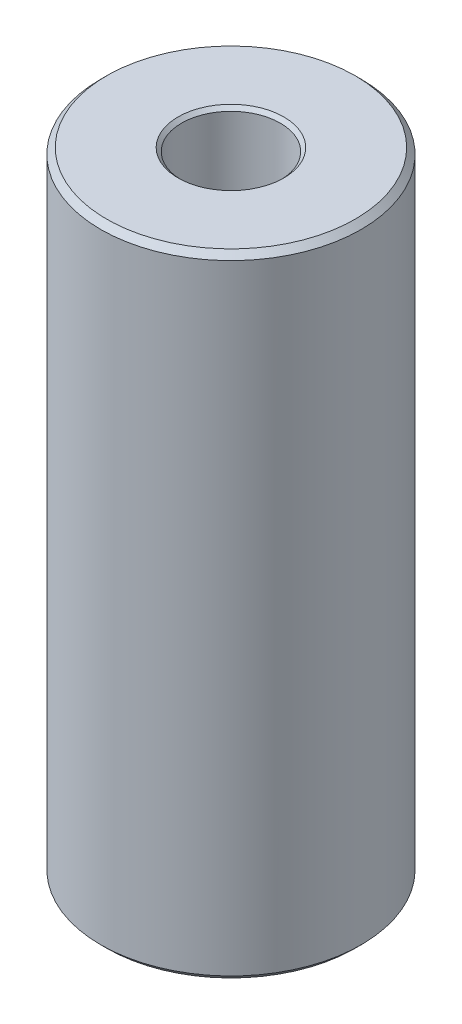
ISO-10303-21;
HEADER;
FILE_DESCRIPTION(('STEP AP214'),'2;1');
FILE_NAME('part.step','',(''),(''),'','','');
FILE_SCHEMA(('AUTOMOTIVE_DESIGN { 1 0 10303 214 1 1 1 1 }'));
ENDSEC;
DATA;
#1=APPLICATION_CONTEXT('core data for automotive mechanical design processes');
#2=APPLICATION_PROTOCOL_DEFINITION('international standard','automotive_design',2000,#1);
#3=PRODUCT_CONTEXT('',#1,'mechanical');
#4=PRODUCT('Part','Part','',(#3));
#5=PRODUCT_RELATED_PRODUCT_CATEGORY('part','',(#4));
#6=PRODUCT_DEFINITION_FORMATION('','',#4);
#7=PRODUCT_DEFINITION_CONTEXT('part definition',#1,'design');
#8=PRODUCT_DEFINITION('design','',#6,#7);
#9=PRODUCT_DEFINITION_SHAPE('','',#8);
#10=(LENGTH_UNIT() NAMED_UNIT(*) SI_UNIT(.MILLI.,.METRE.));
#11=(NAMED_UNIT(*) PLANE_ANGLE_UNIT() SI_UNIT($,.RADIAN.));
#12=(NAMED_UNIT(*) SI_UNIT($,.STERADIAN.) SOLID_ANGLE_UNIT());
#13=UNCERTAINTY_MEASURE_WITH_UNIT(LENGTH_MEASURE(1.E-05),#10,'distance_accuracy_value','');
#14=(GEOMETRIC_REPRESENTATION_CONTEXT(3) GLOBAL_UNCERTAINTY_ASSIGNED_CONTEXT((#13)) GLOBAL_UNIT_ASSIGNED_CONTEXT((#10,
#11,#12)) REPRESENTATION_CONTEXT('',''));
#15=CARTESIAN_POINT('',(0.,0.,0.));
#16=DIRECTION('',(0.,0.,1.));
#17=DIRECTION('',(1.,0.,0.));
#18=AXIS2_PLACEMENT_3D('',#15,#16,#17);
#19=CARTESIAN_POINT('',(0.,-4.1410948476161,0.));
#20=DIRECTION('',(0.,1.,0.));
#21=DIRECTION('',(0.,0.,1.));
#22=AXIS2_PLACEMENT_3D('',#19,#20,#21);
#23=CYLINDRICAL_SURFACE('',#22,3.9751);
#24=CARTESIAN_POINT('',(0.,0.152399999999999,0.));
#25=DIRECTION('',(0.,1.,0.));
#26=DIRECTION('',(0.,0.,1.));
#27=AXIS2_PLACEMENT_3D('',#24,#25,#26);
#28=CIRCLE('',#27,3.9751);
#29=CARTESIAN_POINT('',(0.,0.152399999999999,3.9751));
#30=VERTEX_POINT('',#29);
#31=EDGE_CURVE('E10',#30,#30,#28,.F.);
#32=ORIENTED_EDGE('',*,*,#31,.T.);
#33=EDGE_LOOP('',(#32));
#34=FACE_BOUND('',#33,.T.);
#35=CARTESIAN_POINT('',(0.,3.556,0.));
#36=DIRECTION('',(0.,1.,0.));
#37=DIRECTION('',(0.,0.,1.));
#38=AXIS2_PLACEMENT_3D('',#35,#36,#37);
#39=CIRCLE('',#38,3.9751);
#40=CARTESIAN_POINT('',(0.,3.556,3.9751));
#41=VERTEX_POINT('',#40);
#42=EDGE_CURVE('E67',#41,#41,#39,.T.);
#43=ORIENTED_EDGE('',*,*,#42,.T.);
#44=EDGE_LOOP('',(#43));
#45=FACE_BOUND('',#44,.T.);
#46=ADVANCED_FACE('F32',(#34,#45),#23,.F.);
#47=CARTESIAN_POINT('',(0.,0.,-3.9751));
#48=DIRECTION('',(0.,1.,0.));
#49=DIRECTION('',(0.,0.,1.));
#50=AXIS2_PLACEMENT_3D('',#47,#48,#49);
#51=PLANE('',#50);
#52=CARTESIAN_POINT('',(0.,0.,0.));
#53=DIRECTION('',(0.,1.,0.));
#54=DIRECTION('',(0.,0.,1.));
#55=AXIS2_PLACEMENT_3D('',#52,#53,#54);
#56=CIRCLE('',#55,4.1275);
#57=CARTESIAN_POINT('',(0.,0.,4.1275));
#58=VERTEX_POINT('',#57);
#59=EDGE_CURVE('E39',#58,#58,#56,.T.);
#60=ORIENTED_EDGE('',*,*,#59,.T.);
#61=EDGE_LOOP('',(#60));
#62=FACE_BOUND('',#61,.T.);
#63=CARTESIAN_POINT('',(0.,0.,0.));
#64=DIRECTION('',(0.,1.,0.));
#65=DIRECTION('',(0.,0.,1.));
#66=AXIS2_PLACEMENT_3D('',#63,#64,#65);
#67=CIRCLE('',#66,5.3086);
#68=CARTESIAN_POINT('',(0.,0.,5.3086));
#69=VERTEX_POINT('',#68);
#70=EDGE_CURVE('E55',#69,#69,#67,.F.);
#71=ORIENTED_EDGE('',*,*,#70,.T.);
#72=EDGE_LOOP('',(#71));
#73=FACE_BOUND('',#72,.T.);
#74=ADVANCED_FACE('F91',(#62,#73),#51,.F.);
#75=CARTESIAN_POINT('',(0.,-4.1410948476161,0.));
#76=DIRECTION('',(0.,1.,0.));
#77=DIRECTION('',(0.,0.,1.));
#78=AXIS2_PLACEMENT_3D('',#75,#76,#77);
#79=CYLINDRICAL_SURFACE('',#78,5.5626);
#80=CARTESIAN_POINT('',(0.,0.254,0.));
#81=DIRECTION('',(0.,1.,0.));
#82=DIRECTION('',(0.,0.,1.));
#83=AXIS2_PLACEMENT_3D('',#80,#81,#82);
#84=CIRCLE('',#83,5.5626);
#85=CARTESIAN_POINT('',(0.,0.254,5.5626));
#86=VERTEX_POINT('',#85);
#87=EDGE_CURVE('E58',#86,#86,#84,.T.);
#88=ORIENTED_EDGE('',*,*,#87,.T.);
#89=EDGE_LOOP('',(#88));
#90=FACE_BOUND('',#89,.T.);
#91=CARTESIAN_POINT('',(0.,26.7208,0.));
#92=DIRECTION('',(0.,-1.,0.));
#93=DIRECTION('',(0.,0.,-1.));
#94=AXIS2_PLACEMENT_3D('',#91,#92,#93);
#95=CIRCLE('',#94,5.5626);
#96=CARTESIAN_POINT('',(0.,26.7208,-5.5626));
#97=VERTEX_POINT('',#96);
#98=EDGE_CURVE('E61',#97,#97,#95,.T.);
#99=ORIENTED_EDGE('',*,*,#98,.T.);
#100=EDGE_LOOP('',(#99));
#101=FACE_BOUND('',#100,.T.);
#102=ADVANCED_FACE('F87',(#90,#101),#79,.T.);
#103=CARTESIAN_POINT('',(0.,26.9748,-5.5626));
#104=DIRECTION('',(0.,-1.,0.));
#105=DIRECTION('',(0.,0.,-1.));
#106=AXIS2_PLACEMENT_3D('',#103,#104,#105);
#107=PLANE('',#106);
#108=CARTESIAN_POINT('',(0.,26.9748,0.));
#109=DIRECTION('',(0.,-1.,0.));
#110=DIRECTION('',(0.,0.,-1.));
#111=AXIS2_PLACEMENT_3D('',#108,#109,#110);
#112=CIRCLE('',#111,2.26059999999999);
#113=CARTESIAN_POINT('',(0.,26.9748,-2.26059999999999));
#114=VERTEX_POINT('',#113);
#115=EDGE_CURVE('E43',#114,#114,#112,.T.);
#116=ORIENTED_EDGE('',*,*,#115,.T.);
#117=EDGE_LOOP('',(#116));
#118=FACE_BOUND('',#117,.T.);
#119=CARTESIAN_POINT('',(0.,26.9748,0.));
#120=DIRECTION('',(0.,-1.,0.));
#121=DIRECTION('',(0.,0.,-1.));
#122=AXIS2_PLACEMENT_3D('',#119,#120,#121);
#123=CIRCLE('',#122,5.3086);
#124=CARTESIAN_POINT('',(0.,26.9748,-5.3086));
#125=VERTEX_POINT('',#124);
#126=EDGE_CURVE('E52',#125,#125,#123,.F.);
#127=ORIENTED_EDGE('',*,*,#126,.T.);
#128=EDGE_LOOP('',(#127));
#129=FACE_BOUND('',#128,.T.);
#130=ADVANCED_FACE('F81',(#118,#129),#107,.F.);
#131=CARTESIAN_POINT('',(0.,-4.1410948476161,0.));
#132=DIRECTION('',(0.,1.,0.));
#133=DIRECTION('',(0.,0.,1.));
#134=AXIS2_PLACEMENT_3D('',#131,#132,#133);
#135=CYLINDRICAL_SURFACE('',#134,2.1082);
#136=CARTESIAN_POINT('',(0.,26.8224,0.));
#137=DIRECTION('',(0.,-1.,0.));
#138=DIRECTION('',(0.,0.,-1.));
#139=AXIS2_PLACEMENT_3D('',#136,#137,#138);
#140=CIRCLE('',#139,2.1082);
#141=CARTESIAN_POINT('',(0.,26.8224,-2.1082));
#142=VERTEX_POINT('',#141);
#143=EDGE_CURVE('E47',#142,#142,#140,.F.);
#144=ORIENTED_EDGE('',*,*,#143,.T.);
#145=EDGE_LOOP('',(#144));
#146=FACE_BOUND('',#145,.T.);
#147=CARTESIAN_POINT('',(0.,4.67774668966255,0.));
#148=DIRECTION('',(0.,1.,0.));
#149=DIRECTION('',(0.,0.,1.));
#150=AXIS2_PLACEMENT_3D('',#147,#148,#149);
#151=CIRCLE('',#150,2.1082);
#152=CARTESIAN_POINT('',(0.,4.67774668966255,2.1082));
#153=VERTEX_POINT('',#152);
#154=EDGE_CURVE('E64',#153,#153,#151,.T.);
#155=ORIENTED_EDGE('',*,*,#154,.F.);
#156=EDGE_LOOP('',(#155));
#157=FACE_BOUND('',#156,.T.);
#158=ADVANCED_FACE('F76',(#146,#157),#135,.F.);
#159=CARTESIAN_POINT('',(0.,4.67774668966255,0.));
#160=DIRECTION('',(0.,-1.,0.));
#161=DIRECTION('',(0.,0.,-1.));
#162=AXIS2_PLACEMENT_3D('',#159,#160,#161);
#163=CONICAL_SURFACE('',#162,2.1082,1.02974425867666);
#164=ORIENTED_EDGE('',*,*,#42,.F.);
#165=EDGE_LOOP('',(#164));
#166=FACE_BOUND('',#165,.T.);
#167=ORIENTED_EDGE('',*,*,#154,.T.);
#168=EDGE_LOOP('',(#167));
#169=FACE_BOUND('',#168,.T.);
#170=ADVANCED_FACE('F72',(#166,#169),#163,.F.);
#171=CARTESIAN_POINT('',(0.,0.254,0.));
#172=DIRECTION('',(0.,1.,0.));
#173=DIRECTION('',(0.,0.,1.));
#174=AXIS2_PLACEMENT_3D('',#171,#172,#173);
#175=CONICAL_SURFACE('',#174,5.5626,0.785398163397455);
#176=ORIENTED_EDGE('',*,*,#70,.F.);
#177=EDGE_LOOP('',(#176));
#178=FACE_BOUND('',#177,.T.);
#179=ORIENTED_EDGE('',*,*,#87,.F.);
#180=EDGE_LOOP('',(#179));
#181=FACE_BOUND('',#180,.T.);
#182=ADVANCED_FACE('F75',(#178,#181),#175,.T.);
#183=CARTESIAN_POINT('',(0.,26.9748,0.));
#184=DIRECTION('',(0.,-1.,0.));
#185=DIRECTION('',(0.,0.,-1.));
#186=AXIS2_PLACEMENT_3D('',#183,#184,#185);
#187=CONICAL_SURFACE('',#186,5.3086,0.785398163397445);
#188=ORIENTED_EDGE('',*,*,#98,.F.);
#189=EDGE_LOOP('',(#188));
#190=FACE_BOUND('',#189,.T.);
#191=ORIENTED_EDGE('',*,*,#126,.F.);
#192=EDGE_LOOP('',(#191));
#193=FACE_BOUND('',#192,.T.);
#194=ADVANCED_FACE('F101',(#190,#193),#187,.T.);
#195=CARTESIAN_POINT('',(0.,26.8224,0.));
#196=DIRECTION('',(0.,1.,0.));
#197=DIRECTION('',(0.,0.,1.));
#198=AXIS2_PLACEMENT_3D('',#195,#196,#197);
#199=CONICAL_SURFACE('',#198,2.1082,0.785398163397448);
#200=ORIENTED_EDGE('',*,*,#115,.F.);
#201=EDGE_LOOP('',(#200));
#202=FACE_BOUND('',#201,.T.);
#203=ORIENTED_EDGE('',*,*,#143,.F.);
#204=EDGE_LOOP('',(#203));
#205=FACE_BOUND('',#204,.T.);
#206=ADVANCED_FACE('F104',(#202,#205),#199,.F.);
#207=CARTESIAN_POINT('',(0.,0.,0.));
#208=DIRECTION('',(0.,-1.,0.));
#209=DIRECTION('',(0.,0.,-1.));
#210=AXIS2_PLACEMENT_3D('',#207,#208,#209);
#211=CONICAL_SURFACE('',#210,4.1275,0.785398163397448);
#212=ORIENTED_EDGE('',*,*,#31,.F.);
#213=EDGE_LOOP('',(#212));
#214=FACE_BOUND('',#213,.T.);
#215=ORIENTED_EDGE('',*,*,#59,.F.);
#216=EDGE_LOOP('',(#215));
#217=FACE_BOUND('',#216,.T.);
#218=ADVANCED_FACE('F34',(#214,#217),#211,.F.);
#219=CLOSED_SHELL('',(#46,#74,#102,#130,#158,#170,#182,#194,#206,#218));
#220=MANIFOLD_SOLID_BREP('B2',#219);
#221=ADVANCED_BREP_SHAPE_REPRESENTATION('',(#18,#220),#14);
#222=SHAPE_DEFINITION_REPRESENTATION(#9,#221);
ENDSEC;
END-ISO-10303-21;
